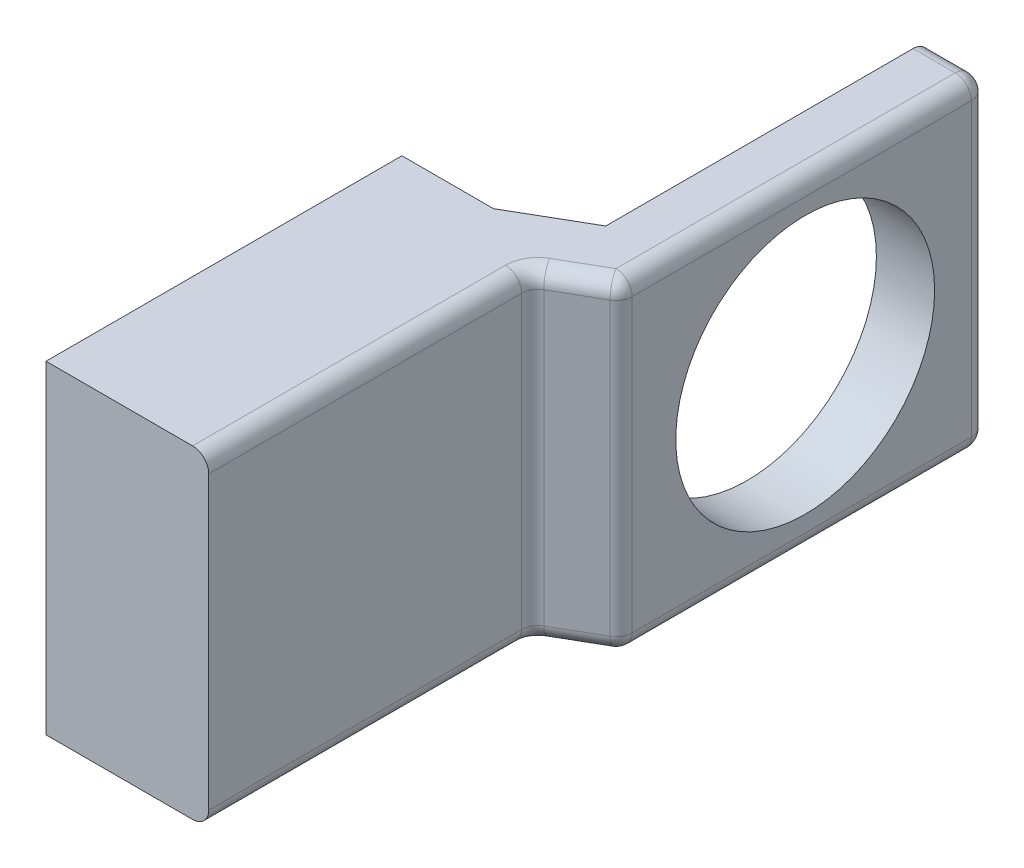
ISO-10303-21;
HEADER;
FILE_DESCRIPTION(('STEP AP214'),'2;1');
FILE_NAME('part.step','',(''),(''),'','','');
FILE_SCHEMA(('AUTOMOTIVE_DESIGN { 1 0 10303 214 1 1 1 1 }'));
ENDSEC;
DATA;
#1=APPLICATION_CONTEXT('core data for automotive mechanical design processes');
#2=APPLICATION_PROTOCOL_DEFINITION('international standard','automotive_design',2000,#1);
#3=PRODUCT_CONTEXT('',#1,'mechanical');
#4=PRODUCT('Part','Part','',(#3));
#5=PRODUCT_RELATED_PRODUCT_CATEGORY('part','',(#4));
#6=PRODUCT_DEFINITION_FORMATION('','',#4);
#7=PRODUCT_DEFINITION_CONTEXT('part definition',#1,'design');
#8=PRODUCT_DEFINITION('design','',#6,#7);
#9=PRODUCT_DEFINITION_SHAPE('','',#8);
#10=(LENGTH_UNIT() NAMED_UNIT(*) SI_UNIT(.MILLI.,.METRE.));
#11=(NAMED_UNIT(*) PLANE_ANGLE_UNIT() SI_UNIT($,.RADIAN.));
#12=(NAMED_UNIT(*) SI_UNIT($,.STERADIAN.) SOLID_ANGLE_UNIT());
#13=UNCERTAINTY_MEASURE_WITH_UNIT(LENGTH_MEASURE(1.E-05),#10,'distance_accuracy_value','');
#14=(GEOMETRIC_REPRESENTATION_CONTEXT(3) GLOBAL_UNCERTAINTY_ASSIGNED_CONTEXT((#13)) GLOBAL_UNIT_ASSIGNED_CONTEXT((#10,
#11,#12)) REPRESENTATION_CONTEXT('',''));
#15=CARTESIAN_POINT('',(0.,0.,0.));
#16=DIRECTION('',(0.,0.,1.));
#17=DIRECTION('',(1.,0.,0.));
#18=AXIS2_PLACEMENT_3D('',#15,#16,#17);
#19=CARTESIAN_POINT('',(0.,100.,110.));
#20=DIRECTION('',(0.,0.,-1.));
#21=DIRECTION('',(-1.,0.,0.));
#22=AXIS2_PLACEMENT_3D('',#19,#20,#21);
#23=PLANE('',#22);
#24=DIRECTION('',(1.,0.,0.));
#25=VECTOR('',#24,1.);
#26=CARTESIAN_POINT('',(0.,0.,110.));
#27=LINE('',#26,#25);
#28=CARTESIAN_POINT('',(0.,0.,110.));
#29=VERTEX_POINT('',#28);
#30=CARTESIAN_POINT('',(45.3000000000003,0.,110.));
#31=VERTEX_POINT('',#30);
#32=EDGE_CURVE('E207',#29,#31,#27,.T.);
#33=ORIENTED_EDGE('',*,*,#32,.T.);
#34=CARTESIAN_POINT('',(45.3000000000003,5.,110.));
#35=DIRECTION('',(0.,0.,-1.));
#36=DIRECTION('',(-1.,0.,0.));
#37=AXIS2_PLACEMENT_3D('',#34,#35,#36);
#38=CIRCLE('',#37,5.);
#39=CARTESIAN_POINT('',(50.3000000000003,5.,110.));
#40=VERTEX_POINT('',#39);
#41=EDGE_CURVE('E267',#31,#40,#38,.F.);
#42=ORIENTED_EDGE('',*,*,#41,.T.);
#43=DIRECTION('',(0.,-1.,0.));
#44=VECTOR('',#43,1.);
#45=CARTESIAN_POINT('',(50.3000000000003,100.,110.));
#46=LINE('',#45,#44);
#47=CARTESIAN_POINT('',(50.3000000000003,95.,110.));
#48=VERTEX_POINT('',#47);
#49=EDGE_CURVE('E234',#48,#40,#46,.T.);
#50=ORIENTED_EDGE('',*,*,#49,.F.);
#51=CARTESIAN_POINT('',(45.3000000000003,95.,110.));
#52=DIRECTION('',(0.,0.,-1.));
#53=DIRECTION('',(-1.,0.,0.));
#54=AXIS2_PLACEMENT_3D('',#51,#52,#53);
#55=CIRCLE('',#54,5.);
#56=CARTESIAN_POINT('',(45.3000000000003,100.,110.));
#57=VERTEX_POINT('',#56);
#58=EDGE_CURVE('E264',#48,#57,#55,.F.);
#59=ORIENTED_EDGE('',*,*,#58,.T.);
#60=DIRECTION('',(1.,0.,0.));
#61=VECTOR('',#60,1.);
#62=CARTESIAN_POINT('',(0.,100.,110.));
#63=LINE('',#62,#61);
#64=CARTESIAN_POINT('',(0.,100.,110.));
#65=VERTEX_POINT('',#64);
#66=EDGE_CURVE('E179',#65,#57,#63,.T.);
#67=ORIENTED_EDGE('',*,*,#66,.F.);
#68=DIRECTION('',(0.,-1.,0.));
#69=VECTOR('',#68,1.);
#70=CARTESIAN_POINT('',(0.,100.,110.));
#71=LINE('',#70,#69);
#72=EDGE_CURVE('E206',#65,#29,#71,.T.);
#73=ORIENTED_EDGE('',*,*,#72,.T.);
#74=EDGE_LOOP('',(#33,#42,#50,#59,#67,#73));
#75=FACE_BOUND('',#74,.T.);
#76=ADVANCED_FACE('F41',(#75),#23,.F.);
#77=CARTESIAN_POINT('',(50.3000000000003,100.,110.));
#78=DIRECTION('',(-1.,0.,0.));
#79=DIRECTION('',(0.,0.,1.));
#80=AXIS2_PLACEMENT_3D('',#77,#78,#79);
#81=PLANE('',#80);
#82=ORIENTED_EDGE('',*,*,#49,.T.);
#83=DIRECTION('',(0.,0.,-1.));
#84=VECTOR('',#83,1.);
#85=CARTESIAN_POINT('',(50.3000000000003,5.,110.));
#86=LINE('',#85,#84);
#87=CARTESIAN_POINT('',(50.3000000000003,5.,13.2790561913613));
#88=VERTEX_POINT('',#87);
#89=EDGE_CURVE('E244',#40,#88,#86,.T.);
#90=ORIENTED_EDGE('',*,*,#89,.T.);
#91=DIRECTION('',(0.,-1.,0.));
#92=VECTOR('',#91,1.);
#93=CARTESIAN_POINT('',(50.3000000000003,100.,13.2790561913613));
#94=LINE('',#93,#92);
#95=CARTESIAN_POINT('',(50.3000000000003,95.,13.2790561913613));
#96=VERTEX_POINT('',#95);
#97=EDGE_CURVE('E238',#88,#96,#94,.F.);
#98=ORIENTED_EDGE('',*,*,#97,.T.);
#99=DIRECTION('',(0.,0.,-1.));
#100=VECTOR('',#99,1.);
#101=CARTESIAN_POINT('',(50.3000000000003,95.,110.));
#102=LINE('',#101,#100);
#103=EDGE_CURVE('E241',#96,#48,#102,.F.);
#104=ORIENTED_EDGE('',*,*,#103,.T.);
#105=EDGE_LOOP('',(#82,#90,#98,#104));
#106=FACE_BOUND('',#105,.T.);
#107=ADVANCED_FACE('F472',(#106),#81,.F.);
#108=CARTESIAN_POINT('',(50.3000000000003,100.,10.3923048454132));
#109=DIRECTION('',(-0.499999999999995,0.,-0.866025403784441));
#110=DIRECTION('',(-0.866025403784441,0.,0.499999999999995));
#111=AXIS2_PLACEMENT_3D('',#108,#109,#110);
#112=PLANE('',#111);
#113=DIRECTION('',(0.866025403784441,0.,-0.499999999999995));
#114=VECTOR('',#113,1.);
#115=CARTESIAN_POINT('',(50.3000000000003,5.,10.3923048454132));
#116=LINE('',#115,#114);
#117=CARTESIAN_POINT('',(52.8000000000003,5.,8.94892917243912));
#118=VERTEX_POINT('',#117);
#119=CARTESIAN_POINT('',(65.8000000000004,5.,1.44337567297406));
#120=VERTEX_POINT('',#119);
#121=EDGE_CURVE('E291',#118,#120,#116,.T.);
#122=ORIENTED_EDGE('',*,*,#121,.T.);
#123=DIRECTION('',(0.,-1.,0.));
#124=VECTOR('',#123,1.);
#125=CARTESIAN_POINT('',(65.8000000000004,100.,1.44337567297406));
#126=LINE('',#125,#124);
#127=CARTESIAN_POINT('',(65.8000000000004,95.,1.44337567297406));
#128=VERTEX_POINT('',#127);
#129=EDGE_CURVE('E295',#120,#128,#126,.F.);
#130=ORIENTED_EDGE('',*,*,#129,.T.);
#131=DIRECTION('',(0.866025403784441,0.,-0.499999999999995));
#132=VECTOR('',#131,1.);
#133=CARTESIAN_POINT('',(50.3000000000003,95.,10.3923048454132));
#134=LINE('',#133,#132);
#135=CARTESIAN_POINT('',(52.8000000000003,95.,8.94892917243912));
#136=VERTEX_POINT('',#135);
#137=EDGE_CURVE('E288',#128,#136,#134,.F.);
#138=ORIENTED_EDGE('',*,*,#137,.T.);
#139=DIRECTION('',(0.,-1.,0.));
#140=VECTOR('',#139,1.);
#141=CARTESIAN_POINT('',(52.8000000000003,0.,8.94892917243913));
#142=LINE('',#141,#140);
#143=EDGE_CURVE('E285',#136,#118,#142,.T.);
#144=ORIENTED_EDGE('',*,*,#143,.T.);
#145=EDGE_LOOP('',(#122,#130,#138,#144));
#146=FACE_BOUND('',#145,.T.);
#147=ADVANCED_FACE('F475',(#146),#112,.F.);
#148=CARTESIAN_POINT('',(68.3000000000004,100.,0.));
#149=DIRECTION('',(-1.,0.,0.));
#150=DIRECTION('',(0.,0.,1.));
#151=AXIS2_PLACEMENT_3D('',#148,#149,#150);
#152=PLANE('',#151);
#153=DIRECTION('',(0.,-1.,0.));
#154=VECTOR('',#153,1.);
#155=CARTESIAN_POINT('',(68.3000000000004,100.,-2.88675134594815));
#156=LINE('',#155,#154);
#157=CARTESIAN_POINT('',(68.3000000000004,95.,-2.88675134594815));
#158=VERTEX_POINT('',#157);
#159=CARTESIAN_POINT('',(68.3000000000004,5.,-2.88675134594815));
#160=VERTEX_POINT('',#159);
#161=EDGE_CURVE('E298',#158,#160,#156,.T.);
#162=ORIENTED_EDGE('',*,*,#161,.T.);
#163=DIRECTION('',(0.,0.,-1.));
#164=VECTOR('',#163,1.);
#165=CARTESIAN_POINT('',(68.3000000000004,5.,0.));
#166=LINE('',#165,#164);
#167=CARTESIAN_POINT('',(68.3000000000003,5.,-107.701705922172));
#168=VERTEX_POINT('',#167);
#169=EDGE_CURVE('E307',#160,#168,#166,.T.);
#170=ORIENTED_EDGE('',*,*,#169,.T.);
#171=DIRECTION('',(0.,-1.,0.));
#172=VECTOR('',#171,1.);
#173=CARTESIAN_POINT('',(68.3000000000003,100.,-107.701705922172));
#174=LINE('',#173,#172);
#175=CARTESIAN_POINT('',(68.3000000000003,95.,-107.701705922172));
#176=VERTEX_POINT('',#175);
#177=EDGE_CURVE('E304',#168,#176,#174,.F.);
#178=ORIENTED_EDGE('',*,*,#177,.T.);
#179=DIRECTION('',(0.,0.,-1.));
#180=VECTOR('',#179,1.);
#181=CARTESIAN_POINT('',(68.3000000000004,95.,0.));
#182=LINE('',#181,#180);
#183=EDGE_CURVE('E301',#176,#158,#182,.F.);
#184=ORIENTED_EDGE('',*,*,#183,.T.);
#185=EDGE_LOOP('',(#162,#170,#178,#184));
#186=FACE_BOUND('',#185,.T.);
#187=CARTESIAN_POINT('',(68.3000000000004,50.,-56.3508529610859));
#188=DIRECTION('',(1.,0.,0.));
#189=DIRECTION('',(0.,0.,-1.));
#190=AXIS2_PLACEMENT_3D('',#187,#188,#189);
#191=CIRCLE('',#190,40.);
#192=CARTESIAN_POINT('',(68.3000000000003,50.,-96.3508529610859));
#193=VERTEX_POINT('',#192);
#194=EDGE_CURVE('E389',#193,#193,#191,.T.);
#195=ORIENTED_EDGE('',*,*,#194,.F.);
#196=EDGE_LOOP('',(#195));
#197=FACE_BOUND('',#196,.T.);
#198=ADVANCED_FACE('F481',(#186,#197),#152,.F.);
#199=CARTESIAN_POINT('',(68.3000000000003,100.,-112.701705922172));
#200=DIRECTION('',(0.,0.,1.));
#201=DIRECTION('',(1.,0.,0.));
#202=AXIS2_PLACEMENT_3D('',#199,#200,#201);
#203=PLANE('',#202);
#204=DIRECTION('',(0.,-1.,0.));
#205=VECTOR('',#204,1.);
#206=CARTESIAN_POINT('',(63.3000000000003,100.,-112.701705922172));
#207=LINE('',#206,#205);
#208=CARTESIAN_POINT('',(63.3000000000003,95.,-112.701705922172));
#209=VERTEX_POINT('',#208);
#210=CARTESIAN_POINT('',(63.3000000000003,5.,-112.701705922172));
#211=VERTEX_POINT('',#210);
#212=EDGE_CURVE('E59',#209,#211,#207,.T.);
#213=ORIENTED_EDGE('',*,*,#212,.T.);
#214=DIRECTION('',(-1.,0.,0.));
#215=VECTOR('',#214,1.);
#216=CARTESIAN_POINT('',(68.3000000000003,5.,-112.701705922172));
#217=LINE('',#216,#215);
#218=CARTESIAN_POINT('',(50.3000000000003,5.,-112.701705922172));
#219=VERTEX_POINT('',#218);
#220=EDGE_CURVE('E315',#211,#219,#217,.T.);
#221=ORIENTED_EDGE('',*,*,#220,.T.);
#222=DIRECTION('',(0.,-1.,0.));
#223=VECTOR('',#222,1.);
#224=CARTESIAN_POINT('',(50.3000000000003,100.,-112.701705922172));
#225=LINE('',#224,#223);
#226=CARTESIAN_POINT('',(50.3000000000003,95.,-112.701705922172));
#227=VERTEX_POINT('',#226);
#228=EDGE_CURVE('E190',#227,#219,#225,.T.);
#229=ORIENTED_EDGE('',*,*,#228,.F.);
#230=DIRECTION('',(-1.,0.,0.));
#231=VECTOR('',#230,1.);
#232=CARTESIAN_POINT('',(68.3000000000003,95.,-112.701705922172));
#233=LINE('',#232,#231);
#234=EDGE_CURVE('E64',#227,#209,#233,.F.);
#235=ORIENTED_EDGE('',*,*,#234,.T.);
#236=EDGE_LOOP('',(#213,#221,#229,#235));
#237=FACE_BOUND('',#236,.T.);
#238=ADVANCED_FACE('F428',(#237),#203,.F.);
#239=CARTESIAN_POINT('',(50.3000000000003,100.,-112.701705922172));
#240=DIRECTION('',(1.,0.,0.));
#241=DIRECTION('',(0.,0.,-1.));
#242=AXIS2_PLACEMENT_3D('',#239,#240,#241);
#243=PLANE('',#242);
#244=CARTESIAN_POINT('',(50.3000000000003,50.,-56.3508529610858));
#245=DIRECTION('',(1.,0.,0.));
#246=DIRECTION('',(0.,0.,-1.));
#247=AXIS2_PLACEMENT_3D('',#244,#245,#246);
#248=CIRCLE('',#247,40.);
#249=CARTESIAN_POINT('',(50.3000000000003,50.,-96.3508529610858));
#250=VERTEX_POINT('',#249);
#251=EDGE_CURVE('E211',#250,#250,#248,.F.);
#252=ORIENTED_EDGE('',*,*,#251,.F.);
#253=EDGE_LOOP('',(#252));
#254=FACE_BOUND('',#253,.T.);
#255=ORIENTED_EDGE('',*,*,#228,.T.);
#256=CARTESIAN_POINT('',(50.3000000000003,5.,-107.701705922172));
#257=DIRECTION('',(1.,0.,0.));
#258=DIRECTION('',(0.,0.,-1.));
#259=AXIS2_PLACEMENT_3D('',#256,#257,#258);
#260=CIRCLE('',#259,5.);
#261=CARTESIAN_POINT('',(50.3000000000003,0.,-107.701705922172));
#262=VERTEX_POINT('',#261);
#263=EDGE_CURVE('E11',#219,#262,#260,.F.);
#264=ORIENTED_EDGE('',*,*,#263,.T.);
#265=DIRECTION('',(0.,0.,1.));
#266=VECTOR('',#265,1.);
#267=CARTESIAN_POINT('',(50.3000000000003,0.,-112.701705922172));
#268=LINE('',#267,#266);
#269=CARTESIAN_POINT('',(50.3000000000003,0.,-12.7017059221718));
#270=VERTEX_POINT('',#269);
#271=EDGE_CURVE('E186',#262,#270,#268,.T.);
#272=ORIENTED_EDGE('',*,*,#271,.T.);
#273=DIRECTION('',(0.,-1.,0.));
#274=VECTOR('',#273,1.);
#275=CARTESIAN_POINT('',(50.3000000000003,100.,-12.7017059221718));
#276=LINE('',#275,#274);
#277=CARTESIAN_POINT('',(50.3000000000003,100.,-12.7017059221718));
#278=VERTEX_POINT('',#277);
#279=EDGE_CURVE('E182',#278,#270,#276,.T.);
#280=ORIENTED_EDGE('',*,*,#279,.F.);
#281=DIRECTION('',(0.,0.,1.));
#282=VECTOR('',#281,1.);
#283=CARTESIAN_POINT('',(50.3000000000003,100.,-112.701705922172));
#284=LINE('',#283,#282);
#285=CARTESIAN_POINT('',(50.3000000000003,100.,-107.701705922172));
#286=VERTEX_POINT('',#285);
#287=EDGE_CURVE('E167',#286,#278,#284,.T.);
#288=ORIENTED_EDGE('',*,*,#287,.F.);
#289=CARTESIAN_POINT('',(50.3000000000003,95.,-107.701705922172));
#290=DIRECTION('',(1.,0.,0.));
#291=DIRECTION('',(0.,0.,-1.));
#292=AXIS2_PLACEMENT_3D('',#289,#290,#291);
#293=CIRCLE('',#292,5.);
#294=EDGE_CURVE('E51',#286,#227,#293,.F.);
#295=ORIENTED_EDGE('',*,*,#294,.T.);
#296=EDGE_LOOP('',(#255,#264,#272,#280,#288,#295));
#297=FACE_BOUND('',#296,.T.);
#298=ADVANCED_FACE('F184',(#254,#297),#243,.F.);
#299=CARTESIAN_POINT('',(50.3000000000003,100.,-12.7017059221718));
#300=DIRECTION('',(0.499999999999995,0.,0.866025403784441));
#301=DIRECTION('',(0.866025403784441,0.,-0.499999999999995));
#302=AXIS2_PLACEMENT_3D('',#299,#300,#301);
#303=PLANE('',#302);
#304=DIRECTION('',(-0.866025403784441,0.,0.499999999999995));
#305=VECTOR('',#304,1.);
#306=CARTESIAN_POINT('',(50.3000000000003,0.,-12.7017059221718));
#307=LINE('',#306,#305);
#308=CARTESIAN_POINT('',(28.3,0.,0.));
#309=VERTEX_POINT('',#308);
#310=EDGE_CURVE('E214',#270,#309,#307,.T.);
#311=ORIENTED_EDGE('',*,*,#310,.T.);
#312=DIRECTION('',(0.,-1.,0.));
#313=VECTOR('',#312,1.);
#314=CARTESIAN_POINT('',(28.3,100.,0.));
#315=LINE('',#314,#313);
#316=CARTESIAN_POINT('',(28.3,100.,0.));
#317=VERTEX_POINT('',#316);
#318=EDGE_CURVE('E191',#317,#309,#315,.T.);
#319=ORIENTED_EDGE('',*,*,#318,.F.);
#320=DIRECTION('',(-0.866025403784441,0.,0.499999999999995));
#321=VECTOR('',#320,1.);
#322=CARTESIAN_POINT('',(50.3000000000003,100.,-12.7017059221718));
#323=LINE('',#322,#321);
#324=EDGE_CURVE('E172',#278,#317,#323,.T.);
#325=ORIENTED_EDGE('',*,*,#324,.F.);
#326=ORIENTED_EDGE('',*,*,#279,.T.);
#327=EDGE_LOOP('',(#311,#319,#325,#326));
#328=FACE_BOUND('',#327,.T.);
#329=ADVANCED_FACE('F193',(#328),#303,.F.);
#330=CARTESIAN_POINT('',(28.3,100.,0.));
#331=DIRECTION('',(0.,0.,1.));
#332=DIRECTION('',(1.,0.,0.));
#333=AXIS2_PLACEMENT_3D('',#330,#331,#332);
#334=PLANE('',#333);
#335=DIRECTION('',(-1.,0.,0.));
#336=VECTOR('',#335,1.);
#337=CARTESIAN_POINT('',(28.3,0.,0.));
#338=LINE('',#337,#336);
#339=CARTESIAN_POINT('',(0.,0.,0.));
#340=VERTEX_POINT('',#339);
#341=EDGE_CURVE('E217',#309,#340,#338,.T.);
#342=ORIENTED_EDGE('',*,*,#341,.T.);
#343=DIRECTION('',(0.,-1.,0.));
#344=VECTOR('',#343,1.);
#345=CARTESIAN_POINT('',(0.,100.,0.));
#346=LINE('',#345,#344);
#347=CARTESIAN_POINT('',(0.,100.,0.));
#348=VERTEX_POINT('',#347);
#349=EDGE_CURVE('E226',#348,#340,#346,.T.);
#350=ORIENTED_EDGE('',*,*,#349,.F.);
#351=DIRECTION('',(-1.,0.,0.));
#352=VECTOR('',#351,1.);
#353=CARTESIAN_POINT('',(28.3,100.,0.));
#354=LINE('',#353,#352);
#355=EDGE_CURVE('E197',#317,#348,#354,.T.);
#356=ORIENTED_EDGE('',*,*,#355,.F.);
#357=ORIENTED_EDGE('',*,*,#318,.T.);
#358=EDGE_LOOP('',(#342,#350,#356,#357));
#359=FACE_BOUND('',#358,.T.);
#360=ADVANCED_FACE('F453',(#359),#334,.F.);
#361=CARTESIAN_POINT('',(0.,100.,0.));
#362=DIRECTION('',(1.,0.,0.));
#363=DIRECTION('',(0.,0.,-1.));
#364=AXIS2_PLACEMENT_3D('',#361,#362,#363);
#365=PLANE('',#364);
#366=DIRECTION('',(0.,0.,1.));
#367=VECTOR('',#366,1.);
#368=CARTESIAN_POINT('',(0.,0.,0.));
#369=LINE('',#368,#367);
#370=EDGE_CURVE('E220',#340,#29,#369,.T.);
#371=ORIENTED_EDGE('',*,*,#370,.T.);
#372=ORIENTED_EDGE('',*,*,#72,.F.);
#373=DIRECTION('',(0.,0.,1.));
#374=VECTOR('',#373,1.);
#375=CARTESIAN_POINT('',(0.,100.,0.));
#376=LINE('',#375,#374);
#377=EDGE_CURVE('E200',#348,#65,#376,.T.);
#378=ORIENTED_EDGE('',*,*,#377,.F.);
#379=ORIENTED_EDGE('',*,*,#349,.T.);
#380=EDGE_LOOP('',(#371,#372,#378,#379));
#381=FACE_BOUND('',#380,.T.);
#382=ADVANCED_FACE('F456',(#381),#365,.F.);
#383=CARTESIAN_POINT('',(0.,100.,0.));
#384=DIRECTION('',(0.,1.,0.));
#385=DIRECTION('',(0.,0.,1.));
#386=AXIS2_PLACEMENT_3D('',#383,#384,#385);
#387=PLANE('',#386);
#388=ORIENTED_EDGE('',*,*,#66,.T.);
#389=DIRECTION('',(0.,0.,-1.));
#390=VECTOR('',#389,1.);
#391=CARTESIAN_POINT('',(45.3000000000003,100.,10.3923048454132));
#392=LINE('',#391,#390);
#393=CARTESIAN_POINT('',(45.3000000000003,100.,13.2790561913613));
#394=VERTEX_POINT('',#393);
#395=EDGE_CURVE('E282',#57,#394,#392,.T.);
#396=ORIENTED_EDGE('',*,*,#395,.T.);
#397=CARTESIAN_POINT('',(55.3000000000003,100.,13.2790561913613));
#398=DIRECTION('',(0.,1.,0.));
#399=DIRECTION('',(0.,0.,1.));
#400=AXIS2_PLACEMENT_3D('',#397,#398,#399);
#401=CIRCLE('',#400,10.);
#402=CARTESIAN_POINT('',(50.3000000000004,100.,4.61880215351692));
#403=VERTEX_POINT('',#402);
#404=EDGE_CURVE('E278',#403,#394,#401,.T.);
#405=ORIENTED_EDGE('',*,*,#404,.F.);
#406=DIRECTION('',(0.866025403784441,0.,-0.499999999999995));
#407=VECTOR('',#406,1.);
#408=CARTESIAN_POINT('',(65.8000000000004,100.,-4.33012701892221));
#409=LINE('',#408,#407);
#410=CARTESIAN_POINT('',(63.3000000000004,100.,-2.88675134594814));
#411=VERTEX_POINT('',#410);
#412=EDGE_CURVE('E275',#403,#411,#409,.T.);
#413=ORIENTED_EDGE('',*,*,#412,.T.);
#414=DIRECTION('',(0.,0.,-1.));
#415=VECTOR('',#414,1.);
#416=CARTESIAN_POINT('',(63.3000000000003,100.,-112.701705922172));
#417=LINE('',#416,#415);
#418=CARTESIAN_POINT('',(63.3000000000003,100.,-107.701705922172));
#419=VERTEX_POINT('',#418);
#420=EDGE_CURVE('E272',#411,#419,#417,.T.);
#421=ORIENTED_EDGE('',*,*,#420,.T.);
#422=DIRECTION('',(-1.,0.,0.));
#423=VECTOR('',#422,1.);
#424=CARTESIAN_POINT('',(50.3000000000003,100.,-107.701705922172));
#425=LINE('',#424,#423);
#426=EDGE_CURVE('E175',#419,#286,#425,.T.);
#427=ORIENTED_EDGE('',*,*,#426,.T.);
#428=ORIENTED_EDGE('',*,*,#287,.T.);
#429=ORIENTED_EDGE('',*,*,#324,.T.);
#430=ORIENTED_EDGE('',*,*,#355,.T.);
#431=ORIENTED_EDGE('',*,*,#377,.T.);
#432=EDGE_LOOP('',(#388,#396,#405,#413,#421,#427,#428,#429,#430,#431));
#433=FACE_BOUND('',#432,.T.);
#434=ADVANCED_FACE('F170',(#433),#387,.T.);
#435=CARTESIAN_POINT('',(0.,0.,0.));
#436=DIRECTION('',(0.,1.,0.));
#437=DIRECTION('',(0.,0.,1.));
#438=AXIS2_PLACEMENT_3D('',#435,#436,#437);
#439=PLANE('',#438);
#440=CARTESIAN_POINT('',(55.3000000000003,0.,13.2790561913613));
#441=DIRECTION('',(0.,1.,0.));
#442=DIRECTION('',(0.,0.,1.));
#443=AXIS2_PLACEMENT_3D('',#440,#441,#442);
#444=CIRCLE('',#443,10.);
#445=CARTESIAN_POINT('',(45.3000000000003,0.,13.2790561913613));
#446=VERTEX_POINT('',#445);
#447=CARTESIAN_POINT('',(50.3000000000004,0.,4.61880215351692));
#448=VERTEX_POINT('',#447);
#449=EDGE_CURVE('E257',#446,#448,#444,.F.);
#450=ORIENTED_EDGE('',*,*,#449,.F.);
#451=DIRECTION('',(0.,0.,-1.));
#452=VECTOR('',#451,1.);
#453=CARTESIAN_POINT('',(45.3000000000003,0.,0.));
#454=LINE('',#453,#452);
#455=EDGE_CURVE('E261',#446,#31,#454,.F.);
#456=ORIENTED_EDGE('',*,*,#455,.T.);
#457=ORIENTED_EDGE('',*,*,#32,.F.);
#458=ORIENTED_EDGE('',*,*,#370,.F.);
#459=ORIENTED_EDGE('',*,*,#341,.F.);
#460=ORIENTED_EDGE('',*,*,#310,.F.);
#461=ORIENTED_EDGE('',*,*,#271,.F.);
#462=DIRECTION('',(-1.,0.,0.));
#463=VECTOR('',#462,1.);
#464=CARTESIAN_POINT('',(0.,0.,-107.701705922172));
#465=LINE('',#464,#463);
#466=CARTESIAN_POINT('',(63.3000000000003,0.,-107.701705922172));
#467=VERTEX_POINT('',#466);
#468=EDGE_CURVE('E248',#262,#467,#465,.F.);
#469=ORIENTED_EDGE('',*,*,#468,.T.);
#470=DIRECTION('',(0.,0.,-1.));
#471=VECTOR('',#470,1.);
#472=CARTESIAN_POINT('',(63.3000000000004,0.,0.));
#473=LINE('',#472,#471);
#474=CARTESIAN_POINT('',(63.3000000000004,0.,-2.88675134594814));
#475=VERTEX_POINT('',#474);
#476=EDGE_CURVE('E251',#467,#475,#473,.F.);
#477=ORIENTED_EDGE('',*,*,#476,.T.);
#478=DIRECTION('',(0.866025403784441,0.,-0.499999999999995));
#479=VECTOR('',#478,1.);
#480=CARTESIAN_POINT('',(14.5749999999998,0.,25.2446405203164));
#481=LINE('',#480,#479);
#482=EDGE_CURVE('E254',#475,#448,#481,.F.);
#483=ORIENTED_EDGE('',*,*,#482,.T.);
#484=EDGE_LOOP('',(#450,#456,#457,#458,#459,#460,#461,#469,#477,#483));
#485=FACE_BOUND('',#484,.T.);
#486=ADVANCED_FACE('F447',(#485),#439,.F.);
#487=CARTESIAN_POINT('',(-0.00100000000015366,50.,-56.3508529610858));
#488=DIRECTION('',(1.,0.,0.));
#489=DIRECTION('',(0.,0.,-1.));
#490=AXIS2_PLACEMENT_3D('',#487,#488,#489);
#491=CYLINDRICAL_SURFACE('',#490,40.);
#492=ORIENTED_EDGE('',*,*,#194,.T.);
#493=EDGE_LOOP('',(#492));
#494=FACE_BOUND('',#493,.T.);
#495=ORIENTED_EDGE('',*,*,#251,.T.);
#496=EDGE_LOOP('',(#495));
#497=FACE_BOUND('',#496,.T.);
#498=ADVANCED_FACE('F527',(#494,#497),#491,.F.);
#499=CARTESIAN_POINT('',(0.,95.,-107.701705922172));
#500=DIRECTION('',(1.,0.,0.));
#501=DIRECTION('',(0.,0.,-1.));
#502=AXIS2_PLACEMENT_3D('',#499,#500,#501);
#503=CYLINDRICAL_SURFACE('',#502,5.);
#504=CARTESIAN_POINT('',(63.3000000000003,95.,-107.701705922172));
#505=DIRECTION('',(1.,0.,0.));
#506=DIRECTION('',(0.,0.,-1.));
#507=AXIS2_PLACEMENT_3D('',#504,#505,#506);
#508=CIRCLE('',#507,5.);
#509=EDGE_CURVE('E45',#209,#419,#508,.T.);
#510=ORIENTED_EDGE('',*,*,#509,.F.);
#511=ORIENTED_EDGE('',*,*,#234,.F.);
#512=ORIENTED_EDGE('',*,*,#294,.F.);
#513=ORIENTED_EDGE('',*,*,#426,.F.);
#514=EDGE_LOOP('',(#510,#511,#512,#513));
#515=FACE_BOUND('',#514,.T.);
#516=ADVANCED_FACE('F43',(#515),#503,.T.);
#517=CARTESIAN_POINT('',(63.3000000000003,95.,-107.701705922172));
#518=DIRECTION('',(0.,0.,1.));
#519=DIRECTION('',(1.,0.,0.));
#520=AXIS2_PLACEMENT_3D('',#517,#518,#519);
#521=SPHERICAL_SURFACE('',#520,5.);
#522=CARTESIAN_POINT('',(63.3000000000003,95.,-107.701705922172));
#523=DIRECTION('',(0.,1.,0.));
#524=DIRECTION('',(0.,0.,1.));
#525=AXIS2_PLACEMENT_3D('',#522,#523,#524);
#526=CIRCLE('',#525,5.);
#527=EDGE_CURVE('E377',#209,#176,#526,.F.);
#528=ORIENTED_EDGE('',*,*,#527,.F.);
#529=ORIENTED_EDGE('',*,*,#509,.T.);
#530=CARTESIAN_POINT('',(63.3000000000003,95.,-107.701705922172));
#531=DIRECTION('',(0.,0.,-1.));
#532=DIRECTION('',(-1.,0.,0.));
#533=AXIS2_PLACEMENT_3D('',#530,#531,#532);
#534=CIRCLE('',#533,5.);
#535=EDGE_CURVE('E380',#176,#419,#534,.F.);
#536=ORIENTED_EDGE('',*,*,#535,.F.);
#537=EDGE_LOOP('',(#528,#529,#536));
#538=FACE_BOUND('',#537,.T.);
#539=ADVANCED_FACE('F522',(#538),#521,.T.);
#540=CARTESIAN_POINT('',(63.3000000000004,95.,0.));
#541=DIRECTION('',(0.,0.,1.));
#542=DIRECTION('',(1.,0.,0.));
#543=AXIS2_PLACEMENT_3D('',#540,#541,#542);
#544=CYLINDRICAL_SURFACE('',#543,5.);
#545=ORIENTED_EDGE('',*,*,#535,.T.);
#546=ORIENTED_EDGE('',*,*,#420,.F.);
#547=CARTESIAN_POINT('',(63.3000000000004,95.,-2.88675134594814));
#548=DIRECTION('',(0.,0.,1.));
#549=DIRECTION('',(1.,0.,0.));
#550=AXIS2_PLACEMENT_3D('',#547,#548,#549);
#551=CIRCLE('',#550,5.);
#552=EDGE_CURVE('E373',#158,#411,#551,.T.);
#553=ORIENTED_EDGE('',*,*,#552,.F.);
#554=ORIENTED_EDGE('',*,*,#183,.F.);
#555=EDGE_LOOP('',(#545,#546,#553,#554));
#556=FACE_BOUND('',#555,.T.);
#557=ADVANCED_FACE('F425',(#556),#544,.T.);
#558=CARTESIAN_POINT('',(63.3000000000003,100.,-107.701705922172));
#559=DIRECTION('',(0.,-1.,0.));
#560=DIRECTION('',(0.,0.,-1.));
#561=AXIS2_PLACEMENT_3D('',#558,#559,#560);
#562=CYLINDRICAL_SURFACE('',#561,5.);
#563=ORIENTED_EDGE('',*,*,#527,.T.);
#564=ORIENTED_EDGE('',*,*,#177,.F.);
#565=CARTESIAN_POINT('',(63.3000000000003,5.,-107.701705922172));
#566=DIRECTION('',(0.,-1.,0.));
#567=DIRECTION('',(0.,0.,-1.));
#568=AXIS2_PLACEMENT_3D('',#565,#566,#567);
#569=CIRCLE('',#568,5.);
#570=EDGE_CURVE('E369',#211,#168,#569,.T.);
#571=ORIENTED_EDGE('',*,*,#570,.F.);
#572=ORIENTED_EDGE('',*,*,#212,.F.);
#573=EDGE_LOOP('',(#563,#564,#571,#572));
#574=FACE_BOUND('',#573,.T.);
#575=ADVANCED_FACE('F437',(#574),#562,.T.);
#576=CARTESIAN_POINT('',(68.3000000000003,5.,-107.701705922172));
#577=DIRECTION('',(-1.,0.,0.));
#578=DIRECTION('',(0.,0.,1.));
#579=AXIS2_PLACEMENT_3D('',#576,#577,#578);
#580=CYLINDRICAL_SURFACE('',#579,5.);
#581=ORIENTED_EDGE('',*,*,#263,.F.);
#582=ORIENTED_EDGE('',*,*,#220,.F.);
#583=CARTESIAN_POINT('',(63.3000000000003,5.,-107.701705922172));
#584=DIRECTION('',(1.,0.,0.));
#585=DIRECTION('',(0.,0.,-1.));
#586=AXIS2_PLACEMENT_3D('',#583,#584,#585);
#587=CIRCLE('',#586,5.);
#588=EDGE_CURVE('E365',#467,#211,#587,.T.);
#589=ORIENTED_EDGE('',*,*,#588,.F.);
#590=ORIENTED_EDGE('',*,*,#468,.F.);
#591=EDGE_LOOP('',(#581,#582,#589,#590));
#592=FACE_BOUND('',#591,.T.);
#593=ADVANCED_FACE('F432',(#592),#580,.T.);
#594=CARTESIAN_POINT('',(63.3000000000004,95.,-2.88675134594814));
#595=DIRECTION('',(0.,0.,1.));
#596=DIRECTION('',(1.,0.,0.));
#597=AXIS2_PLACEMENT_3D('',#594,#595,#596);
#598=SPHERICAL_SURFACE('',#597,5.);
#599=CARTESIAN_POINT('',(63.3000000000004,95.,-2.88675134594814));
#600=DIRECTION('',(0.,1.,0.));
#601=DIRECTION('',(0.,0.,1.));
#602=AXIS2_PLACEMENT_3D('',#599,#600,#601);
#603=CIRCLE('',#602,5.);
#604=EDGE_CURVE('E357',#158,#128,#603,.F.);
#605=ORIENTED_EDGE('',*,*,#604,.F.);
#606=ORIENTED_EDGE('',*,*,#552,.T.);
#607=CARTESIAN_POINT('',(63.3000000000004,95.,-2.88675134594814));
#608=DIRECTION('',(0.866025403784442,0.,-0.499999999999995));
#609=DIRECTION('',(-0.499999999999995,0.,-0.866025403784442));
#610=AXIS2_PLACEMENT_3D('',#607,#608,#609);
#611=CIRCLE('',#610,5.);
#612=EDGE_CURVE('E361',#128,#411,#611,.F.);
#613=ORIENTED_EDGE('',*,*,#612,.F.);
#614=EDGE_LOOP('',(#605,#606,#613));
#615=FACE_BOUND('',#614,.T.);
#616=ADVANCED_FACE('F422',(#615),#598,.T.);
#617=CARTESIAN_POINT('',(63.3000000000003,5.,-107.701705922172));
#618=DIRECTION('',(0.,0.,1.));
#619=DIRECTION('',(1.,0.,0.));
#620=AXIS2_PLACEMENT_3D('',#617,#618,#619);
#621=SPHERICAL_SURFACE('',#620,5.);
#622=ORIENTED_EDGE('',*,*,#588,.T.);
#623=ORIENTED_EDGE('',*,*,#570,.T.);
#624=CARTESIAN_POINT('',(63.3000000000003,5.,-107.701705922172));
#625=DIRECTION('',(0.,0.,-1.));
#626=DIRECTION('',(-1.,0.,0.));
#627=AXIS2_PLACEMENT_3D('',#624,#625,#626);
#628=CIRCLE('',#627,5.);
#629=EDGE_CURVE('E354',#467,#168,#628,.F.);
#630=ORIENTED_EDGE('',*,*,#629,.F.);
#631=EDGE_LOOP('',(#622,#623,#630));
#632=FACE_BOUND('',#631,.T.);
#633=ADVANCED_FACE('F439',(#632),#621,.T.);
#634=CARTESIAN_POINT('',(45.3000000000003,95.,0.));
#635=DIRECTION('',(0.,0.,1.));
#636=DIRECTION('',(1.,0.,0.));
#637=AXIS2_PLACEMENT_3D('',#634,#635,#636);
#638=CYLINDRICAL_SURFACE('',#637,5.);
#639=ORIENTED_EDGE('',*,*,#58,.F.);
#640=ORIENTED_EDGE('',*,*,#103,.F.);
#641=CARTESIAN_POINT('',(45.3000000000003,95.,13.2790561913613));
#642=DIRECTION('',(0.,0.,-1.));
#643=DIRECTION('',(-1.,0.,0.));
#644=AXIS2_PLACEMENT_3D('',#641,#642,#643);
#645=CIRCLE('',#644,5.);
#646=EDGE_CURVE('E350',#394,#96,#645,.T.);
#647=ORIENTED_EDGE('',*,*,#646,.F.);
#648=ORIENTED_EDGE('',*,*,#395,.F.);
#649=EDGE_LOOP('',(#639,#640,#647,#648));
#650=FACE_BOUND('',#649,.T.);
#651=ADVANCED_FACE('F409',(#650),#638,.T.);
#652=CARTESIAN_POINT('',(14.5749999999998,95.,25.2446405203164));
#653=DIRECTION('',(-0.866025403784441,0.,0.499999999999995));
#654=DIRECTION('',(0.499999999999995,0.,0.866025403784441));
#655=AXIS2_PLACEMENT_3D('',#652,#653,#654);
#656=CYLINDRICAL_SURFACE('',#655,5.);
#657=ORIENTED_EDGE('',*,*,#612,.T.);
#658=ORIENTED_EDGE('',*,*,#412,.F.);
#659=CARTESIAN_POINT('',(50.3000000000004,95.,4.61880215351692));
#660=DIRECTION('',(-0.866025403784441,0.,0.499999999999995));
#661=DIRECTION('',(0.499999999999995,0.,0.866025403784442));
#662=AXIS2_PLACEMENT_3D('',#659,#660,#661);
#663=CIRCLE('',#662,5.);
#664=EDGE_CURVE('E346',#136,#403,#663,.T.);
#665=ORIENTED_EDGE('',*,*,#664,.F.);
#666=ORIENTED_EDGE('',*,*,#137,.F.);
#667=EDGE_LOOP('',(#657,#658,#665,#666));
#668=FACE_BOUND('',#667,.T.);
#669=ADVANCED_FACE('F417',(#668),#656,.T.);
#670=CARTESIAN_POINT('',(63.3000000000004,100.,-2.88675134594814));
#671=DIRECTION('',(0.,-1.,0.));
#672=DIRECTION('',(0.,0.,-1.));
#673=AXIS2_PLACEMENT_3D('',#670,#671,#672);
#674=CYLINDRICAL_SURFACE('',#673,5.);
#675=ORIENTED_EDGE('',*,*,#604,.T.);
#676=ORIENTED_EDGE('',*,*,#129,.F.);
#677=CARTESIAN_POINT('',(63.3000000000004,5.,-2.88675134594814));
#678=DIRECTION('',(0.,-1.,0.));
#679=DIRECTION('',(0.,0.,-1.));
#680=AXIS2_PLACEMENT_3D('',#677,#678,#679);
#681=CIRCLE('',#680,5.);
#682=EDGE_CURVE('E342',#160,#120,#681,.T.);
#683=ORIENTED_EDGE('',*,*,#682,.F.);
#684=ORIENTED_EDGE('',*,*,#161,.F.);
#685=EDGE_LOOP('',(#675,#676,#683,#684));
#686=FACE_BOUND('',#685,.T.);
#687=ADVANCED_FACE('F505',(#686),#674,.T.);
#688=CARTESIAN_POINT('',(63.3000000000004,5.,0.));
#689=DIRECTION('',(0.,0.,-1.));
#690=DIRECTION('',(-1.,0.,0.));
#691=AXIS2_PLACEMENT_3D('',#688,#689,#690);
#692=CYLINDRICAL_SURFACE('',#691,5.);
#693=ORIENTED_EDGE('',*,*,#629,.T.);
#694=ORIENTED_EDGE('',*,*,#169,.F.);
#695=CARTESIAN_POINT('',(63.3000000000004,5.,-2.88675134594814));
#696=DIRECTION('',(0.,0.,1.));
#697=DIRECTION('',(1.,0.,0.));
#698=AXIS2_PLACEMENT_3D('',#695,#696,#697);
#699=CIRCLE('',#698,5.);
#700=EDGE_CURVE('E338',#475,#160,#699,.T.);
#701=ORIENTED_EDGE('',*,*,#700,.F.);
#702=ORIENTED_EDGE('',*,*,#476,.F.);
#703=EDGE_LOOP('',(#693,#694,#701,#702));
#704=FACE_BOUND('',#703,.T.);
#705=ADVANCED_FACE('F444',(#704),#692,.T.);
#706=CARTESIAN_POINT('',(55.3000000000003,95.,13.2790561913613));
#707=DIRECTION('',(0.,1.,0.));
#708=DIRECTION('',(0.,0.,1.));
#709=AXIS2_PLACEMENT_3D('',#706,#707,#708);
#710=TOROIDAL_SURFACE('',#709,10.,5.);
#711=ORIENTED_EDGE('',*,*,#404,.T.);
#712=ORIENTED_EDGE('',*,*,#646,.T.);
#713=CARTESIAN_POINT('',(55.3000000000003,95.,13.2790561913613));
#714=DIRECTION('',(0.,1.,0.));
#715=DIRECTION('',(0.,0.,1.));
#716=AXIS2_PLACEMENT_3D('',#713,#714,#715);
#717=CIRCLE('',#716,5.);
#718=EDGE_CURVE('E334',#136,#96,#717,.T.);
#719=ORIENTED_EDGE('',*,*,#718,.F.);
#720=ORIENTED_EDGE('',*,*,#664,.T.);
#721=EDGE_LOOP('',(#711,#712,#719,#720));
#722=FACE_BOUND('',#721,.T.);
#723=ADVANCED_FACE('F413',(#722),#710,.T.);
#724=CARTESIAN_POINT('',(63.3000000000004,5.,-2.88675134594814));
#725=DIRECTION('',(0.,0.,1.));
#726=DIRECTION('',(1.,0.,0.));
#727=AXIS2_PLACEMENT_3D('',#724,#725,#726);
#728=SPHERICAL_SURFACE('',#727,5.);
#729=ORIENTED_EDGE('',*,*,#700,.T.);
#730=ORIENTED_EDGE('',*,*,#682,.T.);
#731=CARTESIAN_POINT('',(63.3000000000004,5.,-2.88675134594814));
#732=DIRECTION('',(0.866025403784441,0.,-0.499999999999995));
#733=DIRECTION('',(-0.499999999999995,0.,-0.866025403784442));
#734=AXIS2_PLACEMENT_3D('',#731,#732,#733);
#735=CIRCLE('',#734,5.);
#736=EDGE_CURVE('E331',#475,#120,#735,.F.);
#737=ORIENTED_EDGE('',*,*,#736,.F.);
#738=EDGE_LOOP('',(#729,#730,#737));
#739=FACE_BOUND('',#738,.T.);
#740=ADVANCED_FACE('F497',(#739),#728,.T.);
#741=CARTESIAN_POINT('',(55.3000000000003,100.,13.2790561913613));
#742=DIRECTION('',(0.,1.,0.));
#743=DIRECTION('',(0.,0.,1.));
#744=AXIS2_PLACEMENT_3D('',#741,#742,#743);
#745=CYLINDRICAL_SURFACE('',#744,5.);
#746=ORIENTED_EDGE('',*,*,#718,.T.);
#747=ORIENTED_EDGE('',*,*,#97,.F.);
#748=CARTESIAN_POINT('',(55.3000000000003,5.,13.2790561913613));
#749=DIRECTION('',(0.,1.,0.));
#750=DIRECTION('',(0.,0.,1.));
#751=AXIS2_PLACEMENT_3D('',#748,#749,#750);
#752=CIRCLE('',#751,5.);
#753=EDGE_CURVE('E327',#118,#88,#752,.T.);
#754=ORIENTED_EDGE('',*,*,#753,.F.);
#755=ORIENTED_EDGE('',*,*,#143,.F.);
#756=EDGE_LOOP('',(#746,#747,#754,#755));
#757=FACE_BOUND('',#756,.T.);
#758=ADVANCED_FACE('F470',(#757),#745,.F.);
#759=CARTESIAN_POINT('',(47.8000000000003,5.,6.06217782649098));
#760=DIRECTION('',(0.866025403784441,0.,-0.499999999999995));
#761=DIRECTION('',(-0.499999999999995,0.,-0.866025403784441));
#762=AXIS2_PLACEMENT_3D('',#759,#760,#761);
#763=CYLINDRICAL_SURFACE('',#762,5.);
#764=ORIENTED_EDGE('',*,*,#736,.T.);
#765=ORIENTED_EDGE('',*,*,#121,.F.);
#766=CARTESIAN_POINT('',(50.3000000000004,5.,4.61880215351692));
#767=DIRECTION('',(-0.866025403784441,0.,0.499999999999995));
#768=DIRECTION('',(0.499999999999995,0.,0.866025403784441));
#769=AXIS2_PLACEMENT_3D('',#766,#767,#768);
#770=CIRCLE('',#769,5.);
#771=EDGE_CURVE('E323',#448,#118,#770,.T.);
#772=ORIENTED_EDGE('',*,*,#771,.F.);
#773=ORIENTED_EDGE('',*,*,#482,.F.);
#774=EDGE_LOOP('',(#764,#765,#772,#773));
#775=FACE_BOUND('',#774,.T.);
#776=ADVANCED_FACE('F491',(#775),#763,.T.);
#777=CARTESIAN_POINT('',(55.3000000000003,5.,13.2790561913613));
#778=DIRECTION('',(0.,1.,0.));
#779=DIRECTION('',(0.,0.,1.));
#780=AXIS2_PLACEMENT_3D('',#777,#778,#779);
#781=TOROIDAL_SURFACE('',#780,10.,5.);
#782=ORIENTED_EDGE('',*,*,#771,.T.);
#783=ORIENTED_EDGE('',*,*,#753,.T.);
#784=CARTESIAN_POINT('',(45.3000000000003,5.,13.2790561913613));
#785=DIRECTION('',(0.,0.,-1.));
#786=DIRECTION('',(-1.,0.,0.));
#787=AXIS2_PLACEMENT_3D('',#784,#785,#786);
#788=CIRCLE('',#787,5.);
#789=EDGE_CURVE('E320',#446,#88,#788,.F.);
#790=ORIENTED_EDGE('',*,*,#789,.F.);
#791=ORIENTED_EDGE('',*,*,#449,.T.);
#792=EDGE_LOOP('',(#782,#783,#790,#791));
#793=FACE_BOUND('',#792,.T.);
#794=ADVANCED_FACE('F465',(#793),#781,.T.);
#795=CARTESIAN_POINT('',(45.3000000000003,5.,110.));
#796=DIRECTION('',(0.,0.,-1.));
#797=DIRECTION('',(-1.,0.,0.));
#798=AXIS2_PLACEMENT_3D('',#795,#796,#797);
#799=CYLINDRICAL_SURFACE('',#798,5.);
#800=ORIENTED_EDGE('',*,*,#41,.F.);
#801=ORIENTED_EDGE('',*,*,#455,.F.);
#802=ORIENTED_EDGE('',*,*,#789,.T.);
#803=ORIENTED_EDGE('',*,*,#89,.F.);
#804=EDGE_LOOP('',(#800,#801,#802,#803));
#805=FACE_BOUND('',#804,.T.);
#806=ADVANCED_FACE('F462',(#805),#799,.T.);
#807=CLOSED_SHELL('',(#76,#107,#147,#198,#238,#298,#329,#360,#382,#434,#486,#498,#516,#539,#557,
#575,#593,#616,#633,#651,#669,#687,#705,#723,#740,#758,#776,#794,#806));
#808=MANIFOLD_SOLID_BREP('B2',#807);
#809=ADVANCED_BREP_SHAPE_REPRESENTATION('',(#18,#808),#14);
#810=SHAPE_DEFINITION_REPRESENTATION(#9,#809);
ENDSEC;
END-ISO-10303-21;
